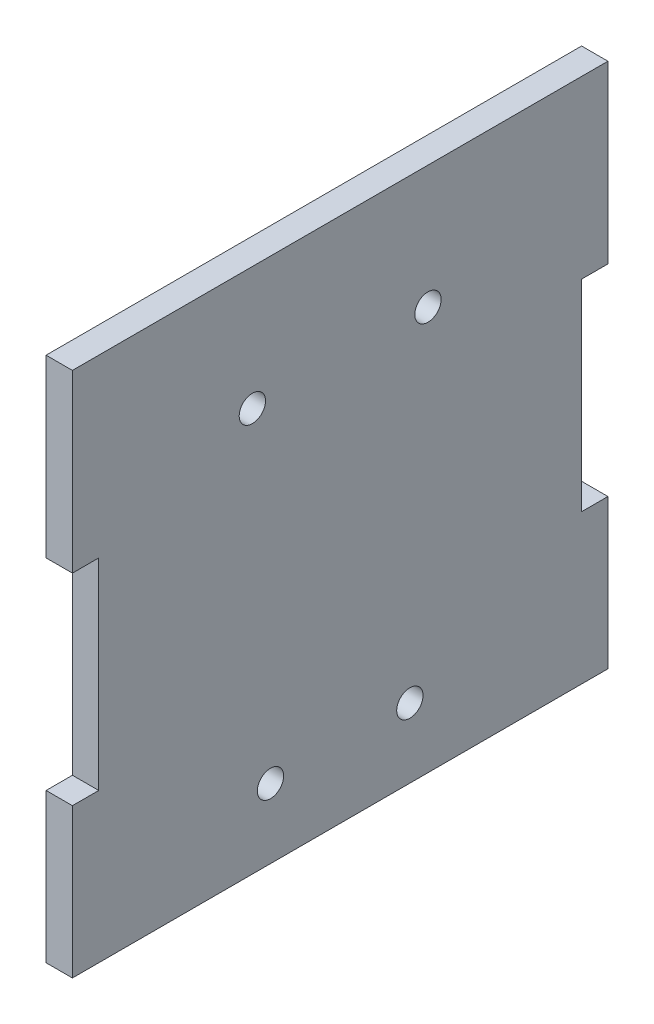
ISO-10303-21;
HEADER;
FILE_DESCRIPTION(('STEP AP214'),'2;1');
FILE_NAME('part.step','',(''),(''),'','','');
FILE_SCHEMA(('AUTOMOTIVE_DESIGN { 1 0 10303 214 1 1 1 1 }'));
ENDSEC;
DATA;
#1=APPLICATION_CONTEXT('core data for automotive mechanical design processes');
#2=APPLICATION_PROTOCOL_DEFINITION('international standard','automotive_design',2000,#1);
#3=PRODUCT_CONTEXT('',#1,'mechanical');
#4=PRODUCT('Part','Part','',(#3));
#5=PRODUCT_RELATED_PRODUCT_CATEGORY('part','',(#4));
#6=PRODUCT_DEFINITION_FORMATION('','',#4);
#7=PRODUCT_DEFINITION_CONTEXT('part definition',#1,'design');
#8=PRODUCT_DEFINITION('design','',#6,#7);
#9=PRODUCT_DEFINITION_SHAPE('','',#8);
#10=(LENGTH_UNIT() NAMED_UNIT(*) SI_UNIT(.MILLI.,.METRE.));
#11=(NAMED_UNIT(*) PLANE_ANGLE_UNIT() SI_UNIT($,.RADIAN.));
#12=(NAMED_UNIT(*) SI_UNIT($,.STERADIAN.) SOLID_ANGLE_UNIT());
#13=UNCERTAINTY_MEASURE_WITH_UNIT(LENGTH_MEASURE(1.E-05),#10,'distance_accuracy_value','');
#14=(GEOMETRIC_REPRESENTATION_CONTEXT(3) GLOBAL_UNCERTAINTY_ASSIGNED_CONTEXT((#13)) GLOBAL_UNIT_ASSIGNED_CONTEXT((#10,
#11,#12)) REPRESENTATION_CONTEXT('',''));
#15=CARTESIAN_POINT('',(0.,0.,0.));
#16=DIRECTION('',(0.,0.,1.));
#17=DIRECTION('',(1.,0.,0.));
#18=AXIS2_PLACEMENT_3D('',#15,#16,#17);
#19=CARTESIAN_POINT('',(3.,0.,-30.5));
#20=DIRECTION('',(0.,0.,1.));
#21=DIRECTION('',(1.,0.,0.));
#22=AXIS2_PLACEMENT_3D('',#19,#20,#21);
#23=PLANE('',#22);
#24=DIRECTION('',(0.,1.,0.));
#25=VECTOR('',#24,1.);
#26=CARTESIAN_POINT('',(0.,0.,-30.5));
#27=LINE('',#26,#25);
#28=CARTESIAN_POINT('',(0.,0.,-30.5));
#29=VERTEX_POINT('',#28);
#30=CARTESIAN_POINT('',(0.,17.,-30.5));
#31=VERTEX_POINT('',#30);
#32=EDGE_CURVE('E161',#29,#31,#27,.T.);
#33=ORIENTED_EDGE('',*,*,#32,.T.);
#34=DIRECTION('',(-1.,0.,0.));
#35=VECTOR('',#34,1.);
#36=CARTESIAN_POINT('',(3.,17.,-30.5));
#37=LINE('',#36,#35);
#38=CARTESIAN_POINT('',(3.,17.,-30.5));
#39=VERTEX_POINT('',#38);
#40=EDGE_CURVE('E44',#39,#31,#37,.T.);
#41=ORIENTED_EDGE('',*,*,#40,.F.);
#42=DIRECTION('',(0.,1.,0.));
#43=VECTOR('',#42,1.);
#44=CARTESIAN_POINT('',(3.,0.,-30.5));
#45=LINE('',#44,#43);
#46=CARTESIAN_POINT('',(3.,0.,-30.5));
#47=VERTEX_POINT('',#46);
#48=EDGE_CURVE('E109',#47,#39,#45,.T.);
#49=ORIENTED_EDGE('',*,*,#48,.F.);
#50=DIRECTION('',(-1.,0.,0.));
#51=VECTOR('',#50,1.);
#52=CARTESIAN_POINT('',(3.,0.,-30.5));
#53=LINE('',#52,#51);
#54=EDGE_CURVE('E11',#47,#29,#53,.T.);
#55=ORIENTED_EDGE('',*,*,#54,.T.);
#56=EDGE_LOOP('',(#33,#41,#49,#55));
#57=FACE_BOUND('',#56,.T.);
#58=ADVANCED_FACE('F36',(#57),#23,.F.);
#59=CARTESIAN_POINT('',(3.,17.,-27.5));
#60=DIRECTION('',(0.,-1.,0.));
#61=DIRECTION('',(0.,0.,-1.));
#62=AXIS2_PLACEMENT_3D('',#59,#60,#61);
#63=PLANE('',#62);
#64=DIRECTION('',(0.,0.,1.));
#65=VECTOR('',#64,1.);
#66=CARTESIAN_POINT('',(0.,17.,-27.5));
#67=LINE('',#66,#65);
#68=CARTESIAN_POINT('',(0.,17.,-27.5));
#69=VERTEX_POINT('',#68);
#70=EDGE_CURVE('E163',#31,#69,#67,.T.);
#71=ORIENTED_EDGE('',*,*,#70,.T.);
#72=DIRECTION('',(-1.,0.,0.));
#73=VECTOR('',#72,1.);
#74=CARTESIAN_POINT('',(3.,17.,-27.5));
#75=LINE('',#74,#73);
#76=CARTESIAN_POINT('',(3.,17.,-27.5));
#77=VERTEX_POINT('',#76);
#78=EDGE_CURVE('E202',#77,#69,#75,.T.);
#79=ORIENTED_EDGE('',*,*,#78,.F.);
#80=DIRECTION('',(0.,0.,1.));
#81=VECTOR('',#80,1.);
#82=CARTESIAN_POINT('',(3.,17.,-27.5));
#83=LINE('',#82,#81);
#84=EDGE_CURVE('E210',#39,#77,#83,.T.);
#85=ORIENTED_EDGE('',*,*,#84,.F.);
#86=ORIENTED_EDGE('',*,*,#40,.T.);
#87=EDGE_LOOP('',(#71,#79,#85,#86));
#88=FACE_BOUND('',#87,.T.);
#89=ADVANCED_FACE('F208',(#88),#63,.F.);
#90=CARTESIAN_POINT('',(3.,17.,-27.5));
#91=DIRECTION('',(0.,0.,1.));
#92=DIRECTION('',(1.,0.,0.));
#93=AXIS2_PLACEMENT_3D('',#90,#91,#92);
#94=PLANE('',#93);
#95=DIRECTION('',(0.,1.,0.));
#96=VECTOR('',#95,1.);
#97=CARTESIAN_POINT('',(0.,17.,-27.5));
#98=LINE('',#97,#96);
#99=CARTESIAN_POINT('',(0.,39.94,-27.5));
#100=VERTEX_POINT('',#99);
#101=EDGE_CURVE('E166',#69,#100,#98,.T.);
#102=ORIENTED_EDGE('',*,*,#101,.T.);
#103=DIRECTION('',(-1.,0.,0.));
#104=VECTOR('',#103,1.);
#105=CARTESIAN_POINT('',(3.,39.94,-27.5));
#106=LINE('',#105,#104);
#107=CARTESIAN_POINT('',(3.,39.94,-27.5));
#108=VERTEX_POINT('',#107);
#109=EDGE_CURVE('E199',#108,#100,#106,.T.);
#110=ORIENTED_EDGE('',*,*,#109,.F.);
#111=DIRECTION('',(0.,1.,0.));
#112=VECTOR('',#111,1.);
#113=CARTESIAN_POINT('',(3.,17.,-27.5));
#114=LINE('',#113,#112);
#115=EDGE_CURVE('E226',#77,#108,#114,.T.);
#116=ORIENTED_EDGE('',*,*,#115,.F.);
#117=ORIENTED_EDGE('',*,*,#78,.T.);
#118=EDGE_LOOP('',(#102,#110,#116,#117));
#119=FACE_BOUND('',#118,.T.);
#120=ADVANCED_FACE('F217',(#119),#94,.F.);
#121=CARTESIAN_POINT('',(3.,39.94,-30.5));
#122=DIRECTION('',(0.,1.,0.));
#123=DIRECTION('',(0.,0.,1.));
#124=AXIS2_PLACEMENT_3D('',#121,#122,#123);
#125=PLANE('',#124);
#126=DIRECTION('',(0.,0.,-1.));
#127=VECTOR('',#126,1.);
#128=CARTESIAN_POINT('',(0.,39.94,-30.5));
#129=LINE('',#128,#127);
#130=CARTESIAN_POINT('',(0.,39.94,-30.5));
#131=VERTEX_POINT('',#130);
#132=EDGE_CURVE('E168',#100,#131,#129,.T.);
#133=ORIENTED_EDGE('',*,*,#132,.T.);
#134=DIRECTION('',(-1.,0.,0.));
#135=VECTOR('',#134,1.);
#136=CARTESIAN_POINT('',(3.,39.94,-30.5));
#137=LINE('',#136,#135);
#138=CARTESIAN_POINT('',(3.,39.94,-30.5));
#139=VERTEX_POINT('',#138);
#140=EDGE_CURVE('E196',#139,#131,#137,.T.);
#141=ORIENTED_EDGE('',*,*,#140,.F.);
#142=DIRECTION('',(0.,0.,-1.));
#143=VECTOR('',#142,1.);
#144=CARTESIAN_POINT('',(3.,39.94,-30.5));
#145=LINE('',#144,#143);
#146=EDGE_CURVE('E223',#108,#139,#145,.T.);
#147=ORIENTED_EDGE('',*,*,#146,.F.);
#148=ORIENTED_EDGE('',*,*,#109,.T.);
#149=EDGE_LOOP('',(#133,#141,#147,#148));
#150=FACE_BOUND('',#149,.T.);
#151=ADVANCED_FACE('F221',(#150),#125,.F.);
#152=CARTESIAN_POINT('',(3.,39.94,-30.5));
#153=DIRECTION('',(0.,0.,1.));
#154=DIRECTION('',(1.,0.,0.));
#155=AXIS2_PLACEMENT_3D('',#152,#153,#154);
#156=PLANE('',#155);
#157=DIRECTION('',(0.,1.,0.));
#158=VECTOR('',#157,1.);
#159=CARTESIAN_POINT('',(0.,39.94,-30.5));
#160=LINE('',#159,#158);
#161=CARTESIAN_POINT('',(0.,59.94,-30.5));
#162=VERTEX_POINT('',#161);
#163=EDGE_CURVE('E170',#131,#162,#160,.T.);
#164=ORIENTED_EDGE('',*,*,#163,.T.);
#165=DIRECTION('',(-1.,0.,0.));
#166=VECTOR('',#165,1.);
#167=CARTESIAN_POINT('',(3.,59.94,-30.5));
#168=LINE('',#167,#166);
#169=CARTESIAN_POINT('',(3.,59.94,-30.5));
#170=VERTEX_POINT('',#169);
#171=EDGE_CURVE('E193',#170,#162,#168,.T.);
#172=ORIENTED_EDGE('',*,*,#171,.F.);
#173=DIRECTION('',(0.,1.,0.));
#174=VECTOR('',#173,1.);
#175=CARTESIAN_POINT('',(3.,39.94,-30.5));
#176=LINE('',#175,#174);
#177=EDGE_CURVE('E225',#139,#170,#176,.T.);
#178=ORIENTED_EDGE('',*,*,#177,.F.);
#179=ORIENTED_EDGE('',*,*,#140,.T.);
#180=EDGE_LOOP('',(#164,#172,#178,#179));
#181=FACE_BOUND('',#180,.T.);
#182=ADVANCED_FACE('F260',(#181),#156,.F.);
#183=CARTESIAN_POINT('',(3.,59.94,30.5));
#184=DIRECTION('',(0.,-1.,0.));
#185=DIRECTION('',(0.,0.,-1.));
#186=AXIS2_PLACEMENT_3D('',#183,#184,#185);
#187=PLANE('',#186);
#188=DIRECTION('',(0.,0.,1.));
#189=VECTOR('',#188,1.);
#190=CARTESIAN_POINT('',(0.,59.94,30.5));
#191=LINE('',#190,#189);
#192=CARTESIAN_POINT('',(0.,59.94,30.5));
#193=VERTEX_POINT('',#192);
#194=EDGE_CURVE('E173',#162,#193,#191,.T.);
#195=ORIENTED_EDGE('',*,*,#194,.T.);
#196=DIRECTION('',(-1.,0.,0.));
#197=VECTOR('',#196,1.);
#198=CARTESIAN_POINT('',(3.,59.94,30.5));
#199=LINE('',#198,#197);
#200=CARTESIAN_POINT('',(3.,59.94,30.5));
#201=VERTEX_POINT('',#200);
#202=EDGE_CURVE('E190',#201,#193,#199,.T.);
#203=ORIENTED_EDGE('',*,*,#202,.F.);
#204=DIRECTION('',(0.,0.,1.));
#205=VECTOR('',#204,1.);
#206=CARTESIAN_POINT('',(3.,59.94,-30.5));
#207=LINE('',#206,#205);
#208=EDGE_CURVE('E228',#170,#201,#207,.T.);
#209=ORIENTED_EDGE('',*,*,#208,.F.);
#210=ORIENTED_EDGE('',*,*,#171,.T.);
#211=EDGE_LOOP('',(#195,#203,#209,#210));
#212=FACE_BOUND('',#211,.T.);
#213=ADVANCED_FACE('F263',(#212),#187,.F.);
#214=CARTESIAN_POINT('',(3.,39.94,30.5));
#215=DIRECTION('',(0.,0.,-1.));
#216=DIRECTION('',(0.,1.,0.));
#217=AXIS2_PLACEMENT_3D('',#214,#215,#216);
#218=PLANE('',#217);
#219=DIRECTION('',(0.,-1.,0.));
#220=VECTOR('',#219,1.);
#221=CARTESIAN_POINT('',(0.,39.94,30.5));
#222=LINE('',#221,#220);
#223=CARTESIAN_POINT('',(0.,39.94,30.5));
#224=VERTEX_POINT('',#223);
#225=EDGE_CURVE('E175',#193,#224,#222,.T.);
#226=ORIENTED_EDGE('',*,*,#225,.T.);
#227=DIRECTION('',(-1.,0.,0.));
#228=VECTOR('',#227,1.);
#229=CARTESIAN_POINT('',(3.,39.94,30.5));
#230=LINE('',#229,#228);
#231=CARTESIAN_POINT('',(3.,39.94,30.5));
#232=VERTEX_POINT('',#231);
#233=EDGE_CURVE('E187',#232,#224,#230,.T.);
#234=ORIENTED_EDGE('',*,*,#233,.F.);
#235=DIRECTION('',(0.,-1.,0.));
#236=VECTOR('',#235,1.);
#237=CARTESIAN_POINT('',(3.,39.94,30.5));
#238=LINE('',#237,#236);
#239=EDGE_CURVE('E234',#201,#232,#238,.T.);
#240=ORIENTED_EDGE('',*,*,#239,.F.);
#241=ORIENTED_EDGE('',*,*,#202,.T.);
#242=EDGE_LOOP('',(#226,#234,#240,#241));
#243=FACE_BOUND('',#242,.T.);
#244=ADVANCED_FACE('F240',(#243),#218,.F.);
#245=CARTESIAN_POINT('',(3.,39.94,30.5));
#246=DIRECTION('',(0.,1.,0.));
#247=DIRECTION('',(0.,0.,1.));
#248=AXIS2_PLACEMENT_3D('',#245,#246,#247);
#249=PLANE('',#248);
#250=DIRECTION('',(0.,0.,-1.));
#251=VECTOR('',#250,1.);
#252=CARTESIAN_POINT('',(0.,39.94,30.5));
#253=LINE('',#252,#251);
#254=CARTESIAN_POINT('',(0.,39.94,27.5));
#255=VERTEX_POINT('',#254);
#256=EDGE_CURVE('E177',#224,#255,#253,.T.);
#257=ORIENTED_EDGE('',*,*,#256,.T.);
#258=DIRECTION('',(-1.,0.,0.));
#259=VECTOR('',#258,1.);
#260=CARTESIAN_POINT('',(3.,39.94,27.5));
#261=LINE('',#260,#259);
#262=CARTESIAN_POINT('',(3.,39.94,27.5));
#263=VERTEX_POINT('',#262);
#264=EDGE_CURVE('E150',#263,#255,#261,.T.);
#265=ORIENTED_EDGE('',*,*,#264,.F.);
#266=DIRECTION('',(0.,0.,-1.));
#267=VECTOR('',#266,1.);
#268=CARTESIAN_POINT('',(3.,39.94,30.5));
#269=LINE('',#268,#267);
#270=EDGE_CURVE('E141',#232,#263,#269,.T.);
#271=ORIENTED_EDGE('',*,*,#270,.F.);
#272=ORIENTED_EDGE('',*,*,#233,.T.);
#273=EDGE_LOOP('',(#257,#265,#271,#272));
#274=FACE_BOUND('',#273,.T.);
#275=ADVANCED_FACE('F244',(#274),#249,.F.);
#276=CARTESIAN_POINT('',(3.,17.,27.5));
#277=DIRECTION('',(0.,0.,-1.));
#278=DIRECTION('',(0.,1.,0.));
#279=AXIS2_PLACEMENT_3D('',#276,#277,#278);
#280=PLANE('',#279);
#281=DIRECTION('',(0.,-1.,0.));
#282=VECTOR('',#281,1.);
#283=CARTESIAN_POINT('',(0.,17.,27.5));
#284=LINE('',#283,#282);
#285=CARTESIAN_POINT('',(0.,17.,27.5));
#286=VERTEX_POINT('',#285);
#287=EDGE_CURVE('E149',#255,#286,#284,.T.);
#288=ORIENTED_EDGE('',*,*,#287,.T.);
#289=DIRECTION('',(-1.,0.,0.));
#290=VECTOR('',#289,1.);
#291=CARTESIAN_POINT('',(3.,17.,27.5));
#292=LINE('',#291,#290);
#293=CARTESIAN_POINT('',(3.,17.,27.5));
#294=VERTEX_POINT('',#293);
#295=EDGE_CURVE('E146',#294,#286,#292,.T.);
#296=ORIENTED_EDGE('',*,*,#295,.F.);
#297=DIRECTION('',(0.,-1.,0.));
#298=VECTOR('',#297,1.);
#299=CARTESIAN_POINT('',(3.,17.,27.5));
#300=LINE('',#299,#298);
#301=EDGE_CURVE('E135',#263,#294,#300,.T.);
#302=ORIENTED_EDGE('',*,*,#301,.F.);
#303=ORIENTED_EDGE('',*,*,#264,.T.);
#304=EDGE_LOOP('',(#288,#296,#302,#303));
#305=FACE_BOUND('',#304,.T.);
#306=ADVANCED_FACE('F147',(#305),#280,.F.);
#307=CARTESIAN_POINT('',(3.,17.,27.5));
#308=DIRECTION('',(0.,-1.,0.));
#309=DIRECTION('',(0.,0.,-1.));
#310=AXIS2_PLACEMENT_3D('',#307,#308,#309);
#311=PLANE('',#310);
#312=DIRECTION('',(0.,0.,1.));
#313=VECTOR('',#312,1.);
#314=CARTESIAN_POINT('',(0.,17.,27.5));
#315=LINE('',#314,#313);
#316=CARTESIAN_POINT('',(0.,17.,30.5));
#317=VERTEX_POINT('',#316);
#318=EDGE_CURVE('E94',#286,#317,#315,.T.);
#319=ORIENTED_EDGE('',*,*,#318,.T.);
#320=DIRECTION('',(-1.,0.,0.));
#321=VECTOR('',#320,1.);
#322=CARTESIAN_POINT('',(3.,17.,30.5));
#323=LINE('',#322,#321);
#324=CARTESIAN_POINT('',(3.,17.,30.5));
#325=VERTEX_POINT('',#324);
#326=EDGE_CURVE('E151',#325,#317,#323,.T.);
#327=ORIENTED_EDGE('',*,*,#326,.F.);
#328=DIRECTION('',(0.,0.,1.));
#329=VECTOR('',#328,1.);
#330=CARTESIAN_POINT('',(3.,17.,27.5));
#331=LINE('',#330,#329);
#332=EDGE_CURVE('E139',#294,#325,#331,.T.);
#333=ORIENTED_EDGE('',*,*,#332,.F.);
#334=ORIENTED_EDGE('',*,*,#295,.T.);
#335=EDGE_LOOP('',(#319,#327,#333,#334));
#336=FACE_BOUND('',#335,.T.);
#337=ADVANCED_FACE('F153',(#336),#311,.F.);
#338=CARTESIAN_POINT('',(3.,0.,30.5));
#339=DIRECTION('',(0.,0.,-1.));
#340=DIRECTION('',(-1.,0.,0.));
#341=AXIS2_PLACEMENT_3D('',#338,#339,#340);
#342=PLANE('',#341);
#343=DIRECTION('',(0.,-1.,0.));
#344=VECTOR('',#343,1.);
#345=CARTESIAN_POINT('',(0.,0.,30.5));
#346=LINE('',#345,#344);
#347=CARTESIAN_POINT('',(0.,0.,30.5));
#348=VERTEX_POINT('',#347);
#349=EDGE_CURVE('E181',#317,#348,#346,.T.);
#350=ORIENTED_EDGE('',*,*,#349,.T.);
#351=DIRECTION('',(-1.,0.,0.));
#352=VECTOR('',#351,1.);
#353=CARTESIAN_POINT('',(3.,0.,30.5));
#354=LINE('',#353,#352);
#355=CARTESIAN_POINT('',(3.,0.,30.5));
#356=VERTEX_POINT('',#355);
#357=EDGE_CURVE('E157',#356,#348,#354,.T.);
#358=ORIENTED_EDGE('',*,*,#357,.F.);
#359=DIRECTION('',(0.,-1.,0.));
#360=VECTOR('',#359,1.);
#361=CARTESIAN_POINT('',(3.,0.,30.5));
#362=LINE('',#361,#360);
#363=EDGE_CURVE('E155',#325,#356,#362,.T.);
#364=ORIENTED_EDGE('',*,*,#363,.F.);
#365=ORIENTED_EDGE('',*,*,#326,.T.);
#366=EDGE_LOOP('',(#350,#358,#364,#365));
#367=FACE_BOUND('',#366,.T.);
#368=ADVANCED_FACE('F247',(#367),#342,.F.);
#369=CARTESIAN_POINT('',(3.,0.,27.5));
#370=DIRECTION('',(0.,1.,0.));
#371=DIRECTION('',(0.,0.,1.));
#372=AXIS2_PLACEMENT_3D('',#369,#370,#371);
#373=PLANE('',#372);
#374=DIRECTION('',(0.,0.,-1.));
#375=VECTOR('',#374,1.);
#376=CARTESIAN_POINT('',(0.,0.,27.5));
#377=LINE('',#376,#375);
#378=EDGE_CURVE('E101',#348,#29,#377,.T.);
#379=ORIENTED_EDGE('',*,*,#378,.T.);
#380=ORIENTED_EDGE('',*,*,#54,.F.);
#381=DIRECTION('',(0.,0.,-1.));
#382=VECTOR('',#381,1.);
#383=CARTESIAN_POINT('',(3.,0.,-27.5));
#384=LINE('',#383,#382);
#385=EDGE_CURVE('E52',#356,#47,#384,.T.);
#386=ORIENTED_EDGE('',*,*,#385,.F.);
#387=ORIENTED_EDGE('',*,*,#357,.T.);
#388=EDGE_LOOP('',(#379,#380,#386,#387));
#389=FACE_BOUND('',#388,.T.);
#390=ADVANCED_FACE('F248',(#389),#373,.F.);
#391=CARTESIAN_POINT('',(3.,0.,0.));
#392=DIRECTION('',(1.,0.,0.));
#393=DIRECTION('',(0.,0.,-1.));
#394=AXIS2_PLACEMENT_3D('',#391,#392,#393);
#395=PLANE('',#394);
#396=CARTESIAN_POINT('',(3.,7.90999999999999,7.93999999999999));
#397=DIRECTION('',(1.,0.,0.));
#398=DIRECTION('',(0.,0.,-1.));
#399=AXIS2_PLACEMENT_3D('',#396,#397,#398);
#400=CIRCLE('',#399,1.5);
#401=CARTESIAN_POINT('',(3.,7.90999999999999,6.43999999999999));
#402=VERTEX_POINT('',#401);
#403=EDGE_CURVE('E164',#402,#402,#400,.T.);
#404=ORIENTED_EDGE('',*,*,#403,.F.);
#405=EDGE_LOOP('',(#404));
#406=FACE_BOUND('',#405,.T.);
#407=CARTESIAN_POINT('',(3.,45.94,-10.));
#408=DIRECTION('',(1.,0.,0.));
#409=DIRECTION('',(0.,0.,-1.));
#410=AXIS2_PLACEMENT_3D('',#407,#408,#409);
#411=CIRCLE('',#410,1.5);
#412=CARTESIAN_POINT('',(3.,45.94,-11.5));
#413=VERTEX_POINT('',#412);
#414=EDGE_CURVE('E326',#413,#413,#411,.T.);
#415=ORIENTED_EDGE('',*,*,#414,.F.);
#416=EDGE_LOOP('',(#415));
#417=FACE_BOUND('',#416,.T.);
#418=CARTESIAN_POINT('',(3.,45.94,9.99999999999999));
#419=DIRECTION('',(1.,0.,0.));
#420=DIRECTION('',(0.,0.,-1.));
#421=AXIS2_PLACEMENT_3D('',#418,#419,#420);
#422=CIRCLE('',#421,1.5);
#423=CARTESIAN_POINT('',(3.,45.94,8.49999999999999));
#424=VERTEX_POINT('',#423);
#425=EDGE_CURVE('E306',#424,#424,#422,.T.);
#426=ORIENTED_EDGE('',*,*,#425,.F.);
#427=EDGE_LOOP('',(#426));
#428=FACE_BOUND('',#427,.T.);
#429=CARTESIAN_POINT('',(3.,7.91,-7.94));
#430=DIRECTION('',(1.,0.,0.));
#431=DIRECTION('',(0.,0.,-1.));
#432=AXIS2_PLACEMENT_3D('',#429,#430,#431);
#433=CIRCLE('',#432,1.5);
#434=CARTESIAN_POINT('',(3.,7.91,-9.44));
#435=VERTEX_POINT('',#434);
#436=EDGE_CURVE('E322',#435,#435,#433,.T.);
#437=ORIENTED_EDGE('',*,*,#436,.F.);
#438=EDGE_LOOP('',(#437));
#439=FACE_BOUND('',#438,.T.);
#440=ORIENTED_EDGE('',*,*,#385,.T.);
#441=ORIENTED_EDGE('',*,*,#48,.T.);
#442=ORIENTED_EDGE('',*,*,#84,.T.);
#443=ORIENTED_EDGE('',*,*,#115,.T.);
#444=ORIENTED_EDGE('',*,*,#146,.T.);
#445=ORIENTED_EDGE('',*,*,#177,.T.);
#446=ORIENTED_EDGE('',*,*,#208,.T.);
#447=ORIENTED_EDGE('',*,*,#239,.T.);
#448=ORIENTED_EDGE('',*,*,#270,.T.);
#449=ORIENTED_EDGE('',*,*,#301,.T.);
#450=ORIENTED_EDGE('',*,*,#332,.T.);
#451=ORIENTED_EDGE('',*,*,#363,.T.);
#452=EDGE_LOOP('',(#440,#441,#442,#443,#444,#445,#446,#447,#448,#449,#450,#451));
#453=FACE_BOUND('',#452,.T.);
#454=ADVANCED_FACE('F137',(#406,#417,#428,#439,#453),#395,.T.);
#455=CARTESIAN_POINT('',(0.,0.,0.));
#456=DIRECTION('',(1.,0.,0.));
#457=DIRECTION('',(0.,0.,-1.));
#458=AXIS2_PLACEMENT_3D('',#455,#456,#457);
#459=PLANE('',#458);
#460=CARTESIAN_POINT('',(0.,7.90999999999999,7.93999999999999));
#461=DIRECTION('',(-1.,0.,0.));
#462=DIRECTION('',(0.,0.,-1.));
#463=AXIS2_PLACEMENT_3D('',#460,#461,#462);
#464=CIRCLE('',#463,1.5);
#465=CARTESIAN_POINT('',(0.,7.90999999999999,6.43999999999999));
#466=VERTEX_POINT('',#465);
#467=EDGE_CURVE('E314',#466,#466,#464,.T.);
#468=ORIENTED_EDGE('',*,*,#467,.F.);
#469=EDGE_LOOP('',(#468));
#470=FACE_BOUND('',#469,.T.);
#471=CARTESIAN_POINT('',(0.,45.94,-10.));
#472=DIRECTION('',(-1.,0.,0.));
#473=DIRECTION('',(0.,0.,1.));
#474=AXIS2_PLACEMENT_3D('',#471,#472,#473);
#475=CIRCLE('',#474,1.5);
#476=CARTESIAN_POINT('',(0.,45.94,-8.5));
#477=VERTEX_POINT('',#476);
#478=EDGE_CURVE('E311',#477,#477,#475,.T.);
#479=ORIENTED_EDGE('',*,*,#478,.F.);
#480=EDGE_LOOP('',(#479));
#481=FACE_BOUND('',#480,.T.);
#482=CARTESIAN_POINT('',(0.,45.94,9.99999999999999));
#483=DIRECTION('',(-1.,0.,0.));
#484=DIRECTION('',(0.,0.,-1.));
#485=AXIS2_PLACEMENT_3D('',#482,#483,#484);
#486=CIRCLE('',#485,1.5);
#487=CARTESIAN_POINT('',(0.,45.94,8.49999999999999));
#488=VERTEX_POINT('',#487);
#489=EDGE_CURVE('E309',#488,#488,#486,.T.);
#490=ORIENTED_EDGE('',*,*,#489,.F.);
#491=EDGE_LOOP('',(#490));
#492=FACE_BOUND('',#491,.T.);
#493=CARTESIAN_POINT('',(0.,7.91,-7.94));
#494=DIRECTION('',(-1.,0.,0.));
#495=DIRECTION('',(0.,0.,1.));
#496=AXIS2_PLACEMENT_3D('',#493,#494,#495);
#497=CIRCLE('',#496,1.5);
#498=CARTESIAN_POINT('',(0.,7.91,-6.44));
#499=VERTEX_POINT('',#498);
#500=EDGE_CURVE('E318',#499,#499,#497,.T.);
#501=ORIENTED_EDGE('',*,*,#500,.F.);
#502=EDGE_LOOP('',(#501));
#503=FACE_BOUND('',#502,.T.);
#504=ORIENTED_EDGE('',*,*,#32,.F.);
#505=ORIENTED_EDGE('',*,*,#378,.F.);
#506=ORIENTED_EDGE('',*,*,#349,.F.);
#507=ORIENTED_EDGE('',*,*,#318,.F.);
#508=ORIENTED_EDGE('',*,*,#287,.F.);
#509=ORIENTED_EDGE('',*,*,#256,.F.);
#510=ORIENTED_EDGE('',*,*,#225,.F.);
#511=ORIENTED_EDGE('',*,*,#194,.F.);
#512=ORIENTED_EDGE('',*,*,#163,.F.);
#513=ORIENTED_EDGE('',*,*,#132,.F.);
#514=ORIENTED_EDGE('',*,*,#101,.F.);
#515=ORIENTED_EDGE('',*,*,#70,.F.);
#516=EDGE_LOOP('',(#504,#505,#506,#507,#508,#509,#510,#511,#512,#513,#514,#515));
#517=FACE_BOUND('',#516,.T.);
#518=ADVANCED_FACE('F212',(#470,#481,#492,#503,#517),#459,.F.);
#519=CARTESIAN_POINT('',(10.,7.91,-7.94));
#520=DIRECTION('',(-1.,0.,0.));
#521=DIRECTION('',(0.,0.,1.));
#522=AXIS2_PLACEMENT_3D('',#519,#520,#521);
#523=CYLINDRICAL_SURFACE('',#522,1.5);
#524=ORIENTED_EDGE('',*,*,#436,.T.);
#525=EDGE_LOOP('',(#524));
#526=FACE_BOUND('',#525,.T.);
#527=ORIENTED_EDGE('',*,*,#500,.T.);
#528=EDGE_LOOP('',(#527));
#529=FACE_BOUND('',#528,.T.);
#530=ADVANCED_FACE('F282',(#526,#529),#523,.F.);
#531=CARTESIAN_POINT('',(10.,45.94,9.99999999999999));
#532=DIRECTION('',(-1.,0.,0.));
#533=DIRECTION('',(0.,0.,1.));
#534=AXIS2_PLACEMENT_3D('',#531,#532,#533);
#535=CYLINDRICAL_SURFACE('',#534,1.5);
#536=ORIENTED_EDGE('',*,*,#425,.T.);
#537=EDGE_LOOP('',(#536));
#538=FACE_BOUND('',#537,.T.);
#539=ORIENTED_EDGE('',*,*,#489,.T.);
#540=EDGE_LOOP('',(#539));
#541=FACE_BOUND('',#540,.T.);
#542=ADVANCED_FACE('F289',(#538,#541),#535,.F.);
#543=CARTESIAN_POINT('',(10.,45.94,-10.));
#544=DIRECTION('',(-1.,0.,0.));
#545=DIRECTION('',(0.,0.,1.));
#546=AXIS2_PLACEMENT_3D('',#543,#544,#545);
#547=CYLINDRICAL_SURFACE('',#546,1.5);
#548=ORIENTED_EDGE('',*,*,#414,.T.);
#549=EDGE_LOOP('',(#548));
#550=FACE_BOUND('',#549,.T.);
#551=ORIENTED_EDGE('',*,*,#478,.T.);
#552=EDGE_LOOP('',(#551));
#553=FACE_BOUND('',#552,.T.);
#554=ADVANCED_FACE('F291',(#550,#553),#547,.F.);
#555=CARTESIAN_POINT('',(10.,7.90999999999999,7.93999999999999));
#556=DIRECTION('',(-1.,0.,0.));
#557=DIRECTION('',(0.,0.,1.));
#558=AXIS2_PLACEMENT_3D('',#555,#556,#557);
#559=CYLINDRICAL_SURFACE('',#558,1.5);
#560=ORIENTED_EDGE('',*,*,#403,.T.);
#561=EDGE_LOOP('',(#560));
#562=FACE_BOUND('',#561,.T.);
#563=ORIENTED_EDGE('',*,*,#467,.T.);
#564=EDGE_LOOP('',(#563));
#565=FACE_BOUND('',#564,.T.);
#566=ADVANCED_FACE('F294',(#562,#565),#559,.F.);
#567=CLOSED_SHELL('',(#58,#89,#120,#151,#182,#213,#244,#275,#306,#337,#368,#390,#454,#518,#530,
#542,#554,#566));
#568=MANIFOLD_SOLID_BREP('B2',#567);
#569=ADVANCED_BREP_SHAPE_REPRESENTATION('',(#18,#568),#14);
#570=SHAPE_DEFINITION_REPRESENTATION(#9,#569);
ENDSEC;
END-ISO-10303-21;
